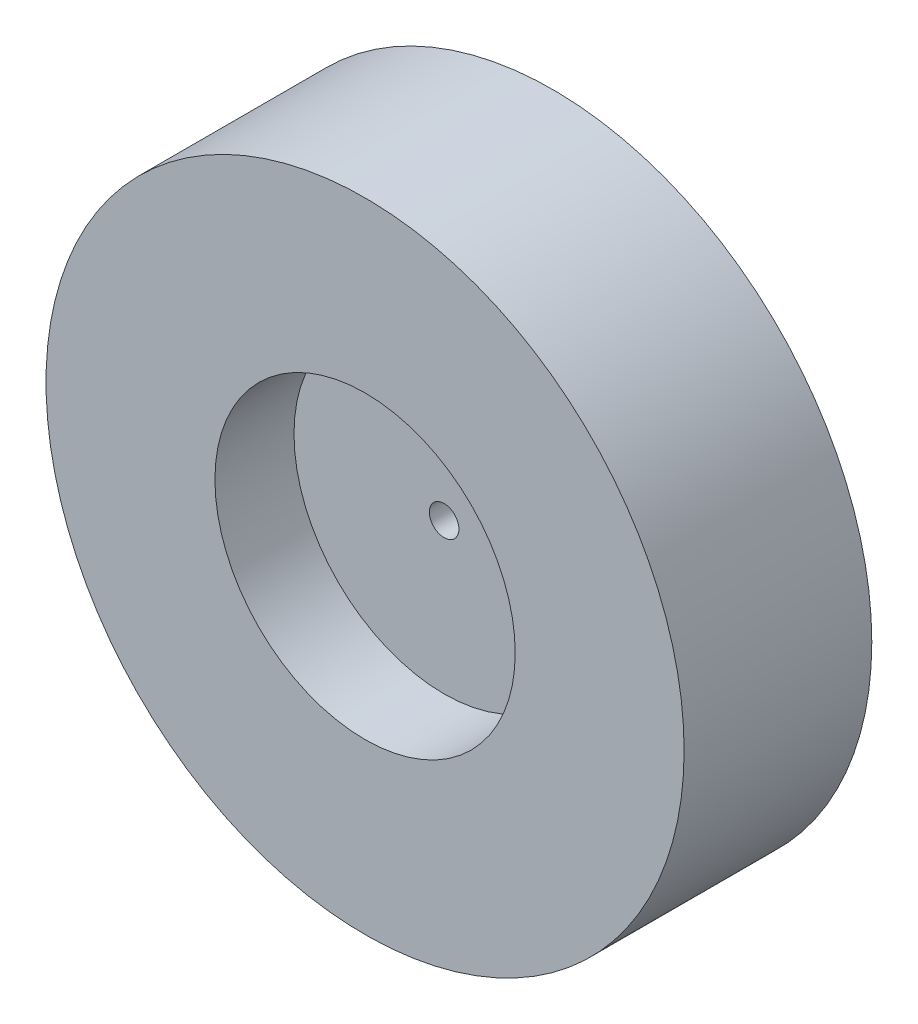
ISO-10303-21;
HEADER;
FILE_DESCRIPTION(('STEP AP214'),'2;1');
FILE_NAME('part.step','',(''),(''),'','','');
FILE_SCHEMA(('AUTOMOTIVE_DESIGN { 1 0 10303 214 1 1 1 1 }'));
ENDSEC;
DATA;
#1=APPLICATION_CONTEXT('core data for automotive mechanical design processes');
#2=APPLICATION_PROTOCOL_DEFINITION('international standard','automotive_design',2000,#1);
#3=PRODUCT_CONTEXT('',#1,'mechanical');
#4=PRODUCT('Part','Part','',(#3));
#5=PRODUCT_RELATED_PRODUCT_CATEGORY('part','',(#4));
#6=PRODUCT_DEFINITION_FORMATION('','',#4);
#7=PRODUCT_DEFINITION_CONTEXT('part definition',#1,'design');
#8=PRODUCT_DEFINITION('design','',#6,#7);
#9=PRODUCT_DEFINITION_SHAPE('','',#8);
#10=(LENGTH_UNIT() NAMED_UNIT(*) SI_UNIT(.MILLI.,.METRE.));
#11=(NAMED_UNIT(*) PLANE_ANGLE_UNIT() SI_UNIT($,.RADIAN.));
#12=(NAMED_UNIT(*) SI_UNIT($,.STERADIAN.) SOLID_ANGLE_UNIT());
#13=UNCERTAINTY_MEASURE_WITH_UNIT(LENGTH_MEASURE(1.E-05),#10,'distance_accuracy_value','');
#14=(GEOMETRIC_REPRESENTATION_CONTEXT(3) GLOBAL_UNCERTAINTY_ASSIGNED_CONTEXT((#13)) GLOBAL_UNIT_ASSIGNED_CONTEXT((#10,
#11,#12)) REPRESENTATION_CONTEXT('',''));
#15=CARTESIAN_POINT('',(0.,0.,0.));
#16=DIRECTION('',(0.,0.,1.));
#17=DIRECTION('',(1.,0.,0.));
#18=AXIS2_PLACEMENT_3D('',#15,#16,#17);
#19=CARTESIAN_POINT('',(0.,0.,31.75));
#20=DIRECTION('',(0.,0.,-1.));
#21=DIRECTION('',(-1.,0.,0.));
#22=AXIS2_PLACEMENT_3D('',#19,#20,#21);
#23=CYLINDRICAL_SURFACE('',#22,50.8);
#24=CARTESIAN_POINT('',(0.,0.,-31.75));
#25=DIRECTION('',(0.,0.,1.));
#26=DIRECTION('',(1.,0.,0.));
#27=AXIS2_PLACEMENT_3D('',#24,#25,#26);
#28=CIRCLE('',#27,50.8);
#29=CARTESIAN_POINT('',(50.8,0.,-31.75));
#30=VERTEX_POINT('',#29);
#31=EDGE_CURVE('E63',#30,#30,#28,.T.);
#32=ORIENTED_EDGE('',*,*,#31,.F.);
#33=EDGE_LOOP('',(#32));
#34=FACE_BOUND('',#33,.T.);
#35=CARTESIAN_POINT('',(0.,0.,-5.));
#36=DIRECTION('',(0.,0.,1.));
#37=DIRECTION('',(1.,0.,0.));
#38=AXIS2_PLACEMENT_3D('',#35,#36,#37);
#39=CIRCLE('',#38,50.8);
#40=CARTESIAN_POINT('',(50.8,0.,-5.));
#41=VERTEX_POINT('',#40);
#42=EDGE_CURVE('E67',#41,#41,#39,.T.);
#43=ORIENTED_EDGE('',*,*,#42,.T.);
#44=EDGE_LOOP('',(#43));
#45=FACE_BOUND('',#44,.T.);
#46=ADVANCED_FACE('F42',(#34,#45),#23,.F.);
#47=CARTESIAN_POINT('',(0.,0.,31.75));
#48=DIRECTION('',(0.,0.,1.));
#49=DIRECTION('',(1.,0.,0.));
#50=AXIS2_PLACEMENT_3D('',#47,#48,#49);
#51=PLANE('',#50);
#52=CARTESIAN_POINT('',(0.,0.,31.75));
#53=DIRECTION('',(0.,0.,1.));
#54=DIRECTION('',(1.,0.,0.));
#55=AXIS2_PLACEMENT_3D('',#52,#53,#54);
#56=CIRCLE('',#55,107.95);
#57=CARTESIAN_POINT('',(107.95,0.,31.75));
#58=VERTEX_POINT('',#57);
#59=EDGE_CURVE('E50',#58,#58,#56,.T.);
#60=ORIENTED_EDGE('',*,*,#59,.T.);
#61=EDGE_LOOP('',(#60));
#62=FACE_BOUND('',#61,.T.);
#63=CARTESIAN_POINT('',(0.,0.,31.75));
#64=DIRECTION('',(0.,0.,1.));
#65=DIRECTION('',(1.,0.,0.));
#66=AXIS2_PLACEMENT_3D('',#63,#64,#65);
#67=CIRCLE('',#66,50.8);
#68=CARTESIAN_POINT('',(50.8,0.,31.75));
#69=VERTEX_POINT('',#68);
#70=EDGE_CURVE('E61',#69,#69,#67,.T.);
#71=ORIENTED_EDGE('',*,*,#70,.F.);
#72=EDGE_LOOP('',(#71));
#73=FACE_BOUND('',#72,.T.);
#74=ADVANCED_FACE('F101',(#62,#73),#51,.T.);
#75=CARTESIAN_POINT('',(0.,0.,-31.75));
#76=DIRECTION('',(0.,0.,1.));
#77=DIRECTION('',(1.,0.,0.));
#78=AXIS2_PLACEMENT_3D('',#75,#76,#77);
#79=PLANE('',#78);
#80=CARTESIAN_POINT('',(0.,0.,-31.75));
#81=DIRECTION('',(0.,0.,1.));
#82=DIRECTION('',(1.,0.,0.));
#83=AXIS2_PLACEMENT_3D('',#80,#81,#82);
#84=CIRCLE('',#83,107.95);
#85=CARTESIAN_POINT('',(107.95,0.,-31.75));
#86=VERTEX_POINT('',#85);
#87=EDGE_CURVE('E55',#86,#86,#84,.T.);
#88=ORIENTED_EDGE('',*,*,#87,.F.);
#89=EDGE_LOOP('',(#88));
#90=FACE_BOUND('',#89,.T.);
#91=ORIENTED_EDGE('',*,*,#31,.T.);
#92=EDGE_LOOP('',(#91));
#93=FACE_BOUND('',#92,.T.);
#94=ADVANCED_FACE('F106',(#90,#93),#79,.F.);
#95=CARTESIAN_POINT('',(0.,0.,31.75));
#96=DIRECTION('',(0.,0.,-1.));
#97=DIRECTION('',(-1.,0.,0.));
#98=AXIS2_PLACEMENT_3D('',#95,#96,#97);
#99=CYLINDRICAL_SURFACE('',#98,107.95);
#100=ORIENTED_EDGE('',*,*,#59,.F.);
#101=EDGE_LOOP('',(#100));
#102=FACE_BOUND('',#101,.T.);
#103=ORIENTED_EDGE('',*,*,#87,.T.);
#104=EDGE_LOOP('',(#103));
#105=FACE_BOUND('',#104,.T.);
#106=ADVANCED_FACE('F44',(#102,#105),#99,.T.);
#107=CARTESIAN_POINT('',(0.,0.,5.));
#108=DIRECTION('',(0.,0.,1.));
#109=DIRECTION('',(1.,0.,0.));
#110=AXIS2_PLACEMENT_3D('',#107,#108,#109);
#111=CIRCLE('',#110,50.8);
#112=CARTESIAN_POINT('',(50.8,0.,5.));
#113=VERTEX_POINT('',#112);
#114=EDGE_CURVE('E10',#113,#113,#111,.T.);
#115=ORIENTED_EDGE('',*,*,#114,.F.);
#116=EDGE_LOOP('',(#115));
#117=FACE_BOUND('',#116,.T.);
#118=ORIENTED_EDGE('',*,*,#70,.T.);
#119=EDGE_LOOP('',(#118));
#120=FACE_BOUND('',#119,.T.);
#121=ADVANCED_FACE('F89',(#117,#120),#23,.F.);
#122=CARTESIAN_POINT('',(0.,0.,5.));
#123=DIRECTION('',(0.,0.,1.));
#124=DIRECTION('',(1.,0.,0.));
#125=AXIS2_PLACEMENT_3D('',#122,#123,#124);
#126=PLANE('',#125);
#127=ORIENTED_EDGE('',*,*,#114,.T.);
#128=EDGE_LOOP('',(#127));
#129=FACE_BOUND('',#128,.T.);
#130=CARTESIAN_POINT('',(0.,0.,5.));
#131=DIRECTION('',(0.,0.,1.));
#132=DIRECTION('',(1.,0.,0.));
#133=AXIS2_PLACEMENT_3D('',#130,#131,#132);
#134=CIRCLE('',#133,5.);
#135=CARTESIAN_POINT('',(5.,0.,5.));
#136=VERTEX_POINT('',#135);
#137=EDGE_CURVE('E74',#136,#136,#134,.T.);
#138=ORIENTED_EDGE('',*,*,#137,.F.);
#139=EDGE_LOOP('',(#138));
#140=FACE_BOUND('',#139,.T.);
#141=ADVANCED_FACE('F86',(#129,#140),#126,.T.);
#142=CARTESIAN_POINT('',(0.,0.,-5.));
#143=DIRECTION('',(0.,0.,1.));
#144=DIRECTION('',(1.,0.,0.));
#145=AXIS2_PLACEMENT_3D('',#142,#143,#144);
#146=PLANE('',#145);
#147=ORIENTED_EDGE('',*,*,#42,.F.);
#148=EDGE_LOOP('',(#147));
#149=FACE_BOUND('',#148,.T.);
#150=CARTESIAN_POINT('',(0.,0.,-5.));
#151=DIRECTION('',(0.,0.,1.));
#152=DIRECTION('',(1.,0.,0.));
#153=AXIS2_PLACEMENT_3D('',#150,#151,#152);
#154=CIRCLE('',#153,5.);
#155=CARTESIAN_POINT('',(5.,0.,-5.));
#156=VERTEX_POINT('',#155);
#157=EDGE_CURVE('E75',#156,#156,#154,.T.);
#158=ORIENTED_EDGE('',*,*,#157,.T.);
#159=EDGE_LOOP('',(#158));
#160=FACE_BOUND('',#159,.T.);
#161=ADVANCED_FACE('F88',(#149,#160),#146,.F.);
#162=CARTESIAN_POINT('',(0.,0.,5.));
#163=DIRECTION('',(0.,0.,-1.));
#164=DIRECTION('',(-1.,0.,0.));
#165=AXIS2_PLACEMENT_3D('',#162,#163,#164);
#166=CYLINDRICAL_SURFACE('',#165,5.);
#167=ORIENTED_EDGE('',*,*,#137,.T.);
#168=EDGE_LOOP('',(#167));
#169=FACE_BOUND('',#168,.T.);
#170=ORIENTED_EDGE('',*,*,#157,.F.);
#171=EDGE_LOOP('',(#170));
#172=FACE_BOUND('',#171,.T.);
#173=ADVANCED_FACE('F83',(#169,#172),#166,.F.);
#174=CLOSED_SHELL('',(#46,#74,#94,#106,#121,#141,#161,#173));
#175=MANIFOLD_SOLID_BREP('B2',#174);
#176=ADVANCED_BREP_SHAPE_REPRESENTATION('',(#18,#175),#14);
#177=SHAPE_DEFINITION_REPRESENTATION(#9,#176);
ENDSEC;
END-ISO-10303-21;
